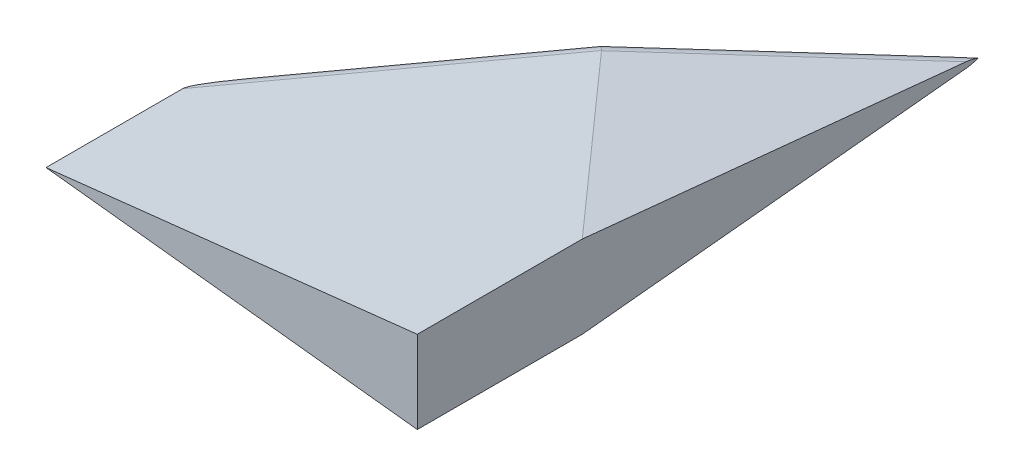
ISO-10303-21;
HEADER;
FILE_DESCRIPTION(('STEP AP214'),'2;1');
FILE_NAME('part.step','',(''),(''),'','','');
FILE_SCHEMA(('AUTOMOTIVE_DESIGN { 1 0 10303 214 1 1 1 1 }'));
ENDSEC;
DATA;
#1=APPLICATION_CONTEXT('core data for automotive mechanical design processes');
#2=APPLICATION_PROTOCOL_DEFINITION('international standard','automotive_design',2000,#1);
#3=PRODUCT_CONTEXT('',#1,'mechanical');
#4=PRODUCT('Part','Part','',(#3));
#5=PRODUCT_RELATED_PRODUCT_CATEGORY('part','',(#4));
#6=PRODUCT_DEFINITION_FORMATION('','',#4);
#7=PRODUCT_DEFINITION_CONTEXT('part definition',#1,'design');
#8=PRODUCT_DEFINITION('design','',#6,#7);
#9=PRODUCT_DEFINITION_SHAPE('','',#8);
#10=(LENGTH_UNIT() NAMED_UNIT(*) SI_UNIT(.MILLI.,.METRE.));
#11=(NAMED_UNIT(*) PLANE_ANGLE_UNIT() SI_UNIT($,.RADIAN.));
#12=(NAMED_UNIT(*) SI_UNIT($,.STERADIAN.) SOLID_ANGLE_UNIT());
#13=UNCERTAINTY_MEASURE_WITH_UNIT(LENGTH_MEASURE(1.E-05),#10,'distance_accuracy_value','');
#14=(GEOMETRIC_REPRESENTATION_CONTEXT(3) GLOBAL_UNCERTAINTY_ASSIGNED_CONTEXT((#13)) GLOBAL_UNIT_ASSIGNED_CONTEXT((#10,
#11,#12)) REPRESENTATION_CONTEXT('',''));
#15=CARTESIAN_POINT('',(0.,0.,0.));
#16=DIRECTION('',(0.,0.,1.));
#17=DIRECTION('',(1.,0.,0.));
#18=AXIS2_PLACEMENT_3D('',#15,#16,#17);
#19=CARTESIAN_POINT('',(-4.97237569060774,10.,-4.47513812154696));
#20=DIRECTION('',(-0.743294146247166,0.,-0.66896473162245));
#21=DIRECTION('',(-0.66896473162245,0.,0.743294146247166));
#22=AXIS2_PLACEMENT_3D('',#19,#20,#21);
#23=PLANE('',#22);
#24=DIRECTION('',(0.667124384994991,0.0741249316661102,-0.741249316661101));
#25=VECTOR('',#24,1.);
#26=CARTESIAN_POINT('',(-4.70725149736415,4.66805789143447,-4.76972055848429));
#27=LINE('',#26,#25);
#28=CARTESIAN_POINT('',(-1.71977252027437,5.,-8.08914164413959));
#29=VERTEX_POINT('',#28);
#30=CARTESIAN_POINT('',(-0.163411010822919,5.17292905660571,-9.81843221019676));
#31=VERTEX_POINT('',#30);
#32=EDGE_CURVE('E184',#29,#31,#27,.T.);
#33=ORIENTED_EDGE('',*,*,#32,.T.);
#34=DIRECTION('',(-0.667124384994991,0.0741249316661101,0.741249316661101));
#35=VECTOR('',#34,1.);
#36=CARTESIAN_POINT('',(22.3840272005419,2.66765814423184,-34.8711413339355));
#37=LINE('',#36,#35);
#38=CARTESIAN_POINT('',(1.39295049862887,5.00000000000004,-11.5477227762543));
#39=VERTEX_POINT('',#38);
#40=EDGE_CURVE('E187',#31,#39,#37,.F.);
#41=ORIENTED_EDGE('',*,*,#40,.T.);
#42=DIRECTION('',(-0.667124384994991,-0.0741249316661101,0.741249316661101));
#43=VECTOR('',#42,1.);
#44=CARTESIAN_POINT('',(-4.69014862363391,4.3241000975264,-4.78872375151788));
#45=LINE('',#44,#43);
#46=CARTESIAN_POINT('',(-0.163411010822941,4.82707094339428,-9.81843221019674));
#47=VERTEX_POINT('',#46);
#48=EDGE_CURVE('E178',#39,#47,#45,.T.);
#49=ORIENTED_EDGE('',*,*,#48,.T.);
#50=DIRECTION('',(0.667124384994991,-0.0741249316661101,-0.741249316661101));
#51=VECTOR('',#50,1.);
#52=CARTESIAN_POINT('',(-22.3858229259356,7.29622782285124,14.8731365843728));
#53=LINE('',#52,#51);
#54=EDGE_CURVE('E181',#47,#29,#53,.F.);
#55=ORIENTED_EDGE('',*,*,#54,.T.);
#56=EDGE_LOOP('',(#33,#41,#49,#55));
#57=FACE_BOUND('',#56,.T.);
#58=ADVANCED_FACE('F67',(#57),#23,.T.);
#59=CARTESIAN_POINT('',(0.,10.,35.));
#60=DIRECTION('',(0.,0.,-1.));
#61=DIRECTION('',(-1.,0.,0.));
#62=AXIS2_PLACEMENT_3D('',#59,#60,#61);
#63=PLANE('',#62);
#64=DIRECTION('',(-0.993883734673619,-0.110431526074847,0.));
#65=VECTOR('',#64,1.);
#66=CARTESIAN_POINT('',(-0.823170731707318,7.40853658536585,35.));
#67=LINE('',#66,#65);
#68=CARTESIAN_POINT('',(22.5,10.,35.));
#69=VERTEX_POINT('',#68);
#70=CARTESIAN_POINT('',(-22.5,5.,35.));
#71=VERTEX_POINT('',#70);
#72=EDGE_CURVE('E153',#69,#71,#67,.T.);
#73=ORIENTED_EDGE('',*,*,#72,.T.);
#74=DIRECTION('',(-0.993883734673619,0.110431526074846,0.));
#75=VECTOR('',#74,1.);
#76=CARTESIAN_POINT('',(0.274390243902438,2.46951219512195,35.));
#77=LINE('',#76,#75);
#78=CARTESIAN_POINT('',(22.5,0.,35.));
#79=VERTEX_POINT('',#78);
#80=EDGE_CURVE('E138',#79,#71,#77,.T.);
#81=ORIENTED_EDGE('',*,*,#80,.F.);
#82=DIRECTION('',(0.,-1.,0.));
#83=VECTOR('',#82,1.);
#84=CARTESIAN_POINT('',(22.5,10.,35.));
#85=LINE('',#84,#83);
#86=EDGE_CURVE('E152',#69,#79,#85,.T.);
#87=ORIENTED_EDGE('',*,*,#86,.F.);
#88=EDGE_LOOP('',(#73,#81,#87));
#89=FACE_BOUND('',#88,.T.);
#90=ADVANCED_FACE('F151',(#89),#63,.F.);
#91=CARTESIAN_POINT('',(-22.5,8.41584158415842,-0.841584158415842));
#92=DIRECTION('',(0.,-0.995037190209989,0.0995037190209989));
#93=DIRECTION('',(0.,-0.0995037190209989,-0.995037190209989));
#94=AXIS2_PLACEMENT_3D('',#91,#92,#93);
#95=PLANE('',#94);
#96=DIRECTION('',(0.,-0.0995037190209989,-0.995037190209989));
#97=VECTOR('',#96,1.);
#98=CARTESIAN_POINT('',(22.5,8.41584158415842,-0.841584158415842));
#99=LINE('',#98,#97);
#100=CARTESIAN_POINT('',(22.5,10.,15.));
#101=VERTEX_POINT('',#100);
#102=CARTESIAN_POINT('',(22.5,5.34883584933013,-31.5116415066987));
#103=VERTEX_POINT('',#102);
#104=EDGE_CURVE('E234',#101,#103,#99,.T.);
#105=ORIENTED_EDGE('',*,*,#104,.T.);
#106=DIRECTION('',(-0.667124384994991,0.0741249316661101,0.741249316661101));
#107=VECTOR('',#106,1.);
#108=CARTESIAN_POINT('',(1.74226256615985,7.65525111975682,-8.44748880243186));
#109=LINE('',#108,#107);
#110=CARTESIAN_POINT('',(1.56976132198561,7.67441792466506,-8.25582075334938));
#111=VERTEX_POINT('',#110);
#112=EDGE_CURVE('E165',#103,#111,#109,.T.);
#113=ORIENTED_EDGE('',*,*,#112,.T.);
#114=DIRECTION('',(-0.667124384994991,-0.0741249316661101,-0.741249316661101));
#115=VECTOR('',#114,1.);
#116=CARTESIAN_POINT('',(-5.43956043956039,6.8956043956044,-16.0439560439561));
#117=LINE('',#116,#115);
#118=EDGE_CURVE('E160',#101,#111,#117,.T.);
#119=ORIENTED_EDGE('',*,*,#118,.F.);
#120=EDGE_LOOP('',(#105,#113,#119));
#121=FACE_BOUND('',#120,.T.);
#122=ADVANCED_FACE('F249',(#121),#95,.F.);
#123=CARTESIAN_POINT('',(22.5,10.,0.));
#124=DIRECTION('',(1.,0.,0.));
#125=DIRECTION('',(0.,0.,-1.));
#126=AXIS2_PLACEMENT_3D('',#123,#124,#125);
#127=PLANE('',#126);
#128=CARTESIAN_POINT('',(22.5,7.13875712619484,-31.2628822091462));
#129=DIRECTION('',(1.,0.,0.));
#130=DIRECTION('',(0.,-0.0995037190209989,0.995037190209989));
#131=AXIS2_PLACEMENT_3D('',#128,#129,#130);
#132=ELLIPSE('',#131,3.74742710089779,2.5);
#133=CARTESIAN_POINT('',(22.5,4.65116415066987,-31.5116415066987));
#134=VERTEX_POINT('',#133);
#135=CARTESIAN_POINT('',(22.5,4.99999999999999,-32.9624381182908));
#136=VERTEX_POINT('',#135);
#137=EDGE_CURVE('E191',#134,#136,#132,.T.);
#138=ORIENTED_EDGE('',*,*,#137,.T.);
#139=CARTESIAN_POINT('',(22.5,2.86124287380516,-31.2628822091462));
#140=DIRECTION('',(1.,0.,0.));
#141=DIRECTION('',(0.,-0.0995037190209989,-0.995037190209989));
#142=AXIS2_PLACEMENT_3D('',#139,#140,#141);
#143=ELLIPSE('',#142,3.74742710089779,2.5);
#144=EDGE_CURVE('E194',#136,#103,#143,.T.);
#145=ORIENTED_EDGE('',*,*,#144,.T.);
#146=ORIENTED_EDGE('',*,*,#104,.F.);
#147=DIRECTION('',(0.,0.,1.));
#148=VECTOR('',#147,1.);
#149=CARTESIAN_POINT('',(22.5,10.,0.));
#150=LINE('',#149,#148);
#151=EDGE_CURVE('E146',#101,#69,#150,.T.);
#152=ORIENTED_EDGE('',*,*,#151,.T.);
#153=ORIENTED_EDGE('',*,*,#86,.T.);
#154=DIRECTION('',(0.,0.,1.));
#155=VECTOR('',#154,1.);
#156=CARTESIAN_POINT('',(22.5,0.,0.));
#157=LINE('',#156,#155);
#158=CARTESIAN_POINT('',(22.5,0.,15.));
#159=VERTEX_POINT('',#158);
#160=EDGE_CURVE('E135',#159,#79,#157,.T.);
#161=ORIENTED_EDGE('',*,*,#160,.F.);
#162=DIRECTION('',(0.,0.0995037190209989,-0.995037190209989));
#163=VECTOR('',#162,1.);
#164=CARTESIAN_POINT('',(22.5,1.48514851485148,0.148514851485148));
#165=LINE('',#164,#163);
#166=EDGE_CURVE('E147',#159,#134,#165,.T.);
#167=ORIENTED_EDGE('',*,*,#166,.T.);
#168=EDGE_LOOP('',(#138,#145,#146,#152,#153,#161,#167));
#169=FACE_BOUND('',#168,.T.);
#170=ADVANCED_FACE('F157',(#169),#127,.T.);
#171=CARTESIAN_POINT('',(-22.5,1.48514851485148,0.148514851485148));
#172=DIRECTION('',(0.,-0.995037190209989,-0.0995037190209989));
#173=DIRECTION('',(0.,0.0995037190209989,-0.995037190209989));
#174=AXIS2_PLACEMENT_3D('',#171,#172,#173);
#175=PLANE('',#174);
#176=DIRECTION('',(0.667124384994991,-0.0741249316661101,0.741249316661101));
#177=VECTOR('',#176,1.);
#178=CARTESIAN_POINT('',(-4.94505494505496,3.04945054945055,-15.4945054945055));
#179=LINE('',#178,#177);
#180=CARTESIAN_POINT('',(1.56976132198558,2.32558207533493,-8.25582075334935));
#181=VERTEX_POINT('',#180);
#182=EDGE_CURVE('E140',#181,#159,#179,.T.);
#183=ORIENTED_EDGE('',*,*,#182,.F.);
#184=DIRECTION('',(-0.667124384994991,-0.0741249316661101,0.741249316661101));
#185=VECTOR('',#184,1.);
#186=CARTESIAN_POINT('',(-13.3401550162578,0.668924704419007,8.31075295580991));
#187=LINE('',#186,#185);
#188=EDGE_CURVE('E12',#181,#134,#187,.F.);
#189=ORIENTED_EDGE('',*,*,#188,.T.);
#190=ORIENTED_EDGE('',*,*,#166,.F.);
#191=EDGE_LOOP('',(#183,#189,#190));
#192=FACE_BOUND('',#191,.T.);
#193=ADVANCED_FACE('F256',(#192),#175,.T.);
#194=CARTESIAN_POINT('',(-0.823170731707318,7.40853658536585,-35.));
#195=DIRECTION('',(-0.110431526074847,0.993883734673619,0.));
#196=DIRECTION('',(-0.993883734673619,-0.110431526074847,0.));
#197=AXIS2_PLACEMENT_3D('',#194,#195,#196);
#198=PLANE('',#197);
#199=ORIENTED_EDGE('',*,*,#118,.T.);
#200=CARTESIAN_POINT('',(-9.62440706787677,6.43062143690258,4.43090342182799));
#201=DIRECTION('',(-0.110431526074847,0.993883734673619,0.));
#202=DIRECTION('',(0.658035225121601,0.0731150250135112,-0.749429006388489));
#203=AXIS2_PLACEMENT_3D('',#200,#201,#202);
#204=ELLIPSE('',#203,16.9671978378616,2.5);
#205=CARTESIAN_POINT('',(1.54229462264742,7.67136606918304,-8.28329714007346));
#206=VERTEX_POINT('',#205);
#207=EDGE_CURVE('E175',#111,#206,#204,.T.);
#208=ORIENTED_EDGE('',*,*,#207,.T.);
#209=DIRECTION('',(0.667124384994991,0.0741249316661102,-0.741249316661101));
#210=VECTOR('',#209,1.);
#211=CARTESIAN_POINT('',(13.6880918662535,9.02089909625039,-21.7786274107469));
#212=LINE('',#211,#210);
#213=CARTESIAN_POINT('',(-22.5,4.99999999999999,18.430363551757));
#214=VERTEX_POINT('',#213);
#215=EDGE_CURVE('E172',#206,#214,#212,.F.);
#216=ORIENTED_EDGE('',*,*,#215,.T.);
#217=DIRECTION('',(0.,0.,1.));
#218=VECTOR('',#217,1.);
#219=CARTESIAN_POINT('',(-22.5,5.,-35.));
#220=LINE('',#219,#218);
#221=EDGE_CURVE('E232',#214,#71,#220,.T.);
#222=ORIENTED_EDGE('',*,*,#221,.T.);
#223=ORIENTED_EDGE('',*,*,#72,.F.);
#224=ORIENTED_EDGE('',*,*,#151,.F.);
#225=EDGE_LOOP('',(#199,#208,#216,#222,#223,#224));
#226=FACE_BOUND('',#225,.T.);
#227=ADVANCED_FACE('F231',(#226),#198,.T.);
#228=CARTESIAN_POINT('',(0.274390243902438,2.46951219512195,-35.));
#229=DIRECTION('',(0.110431526074846,0.993883734673619,0.));
#230=DIRECTION('',(-0.993883734673619,0.110431526074846,0.));
#231=AXIS2_PLACEMENT_3D('',#228,#229,#230);
#232=PLANE('',#231);
#233=ORIENTED_EDGE('',*,*,#221,.F.);
#234=DIRECTION('',(0.667124384994991,-0.07412493166611,-0.741249316661101));
#235=VECTOR('',#234,1.);
#236=CARTESIAN_POINT('',(1.69633362449522,2.3115184861672,-8.45445158657102));
#237=LINE('',#236,#235);
#238=CARTESIAN_POINT('',(1.5422946226474,2.32863393081695,-8.28329714007344));
#239=VERTEX_POINT('',#238);
#240=EDGE_CURVE('E77',#214,#239,#237,.T.);
#241=ORIENTED_EDGE('',*,*,#240,.T.);
#242=CARTESIAN_POINT('',(-9.6244070678768,3.56937856309742,4.43090342182802));
#243=DIRECTION('',(0.110431526074846,0.993883734673619,0.));
#244=DIRECTION('',(-0.658035225121601,0.0731150250135111,0.749429006388489));
#245=AXIS2_PLACEMENT_3D('',#242,#243,#244);
#246=ELLIPSE('',#245,16.9671978378616,2.5);
#247=EDGE_CURVE('E89',#239,#181,#246,.F.);
#248=ORIENTED_EDGE('',*,*,#247,.T.);
#249=ORIENTED_EDGE('',*,*,#182,.T.);
#250=ORIENTED_EDGE('',*,*,#160,.T.);
#251=ORIENTED_EDGE('',*,*,#80,.T.);
#252=EDGE_LOOP('',(#233,#241,#248,#249,#250,#251));
#253=FACE_BOUND('',#252,.T.);
#254=ADVANCED_FACE('F137',(#253),#232,.F.);
#255=CARTESIAN_POINT('',(14.4586761759461,3.40886518548861,-22.3280779601974));
#256=DIRECTION('',(-0.667124384994991,0.07412493166611,0.741249316661101));
#257=DIRECTION('',(0.743294146247166,0.,0.66896473162245));
#258=AXIS2_PLACEMENT_3D('',#255,#256,#257);
#259=CYLINDRICAL_SURFACE('',#258,2.5);
#260=CARTESIAN_POINT('',(0.138462845343583,5.,-6.41672981508351));
#261=DIRECTION('',(0.,1.,0.));
#262=DIRECTION('',(-0.66896473162245,0.,0.743294146247166));
#263=AXIS2_PLACEMENT_3D('',#260,#261,#262);
#264=ELLIPSE('',#263,33.7268439080802,2.5);
#265=EDGE_CURVE('E207',#29,#214,#264,.T.);
#266=ORIENTED_EDGE('',*,*,#265,.F.);
#267=ORIENTED_EDGE('',*,*,#54,.F.);
#268=CARTESIAN_POINT('',(1.69482435479496,4.82707094339428,-8.1460203811406));
#269=DIRECTION('',(-0.66896473162245,0.,0.743294146247166));
#270=DIRECTION('',(0.,-1.,0.));
#271=AXIS2_PLACEMENT_3D('',#268,#269,#270);
#272=ELLIPSE('',#271,2.50689656482678,2.5);
#273=EDGE_CURVE('E71',#239,#47,#272,.F.);
#274=ORIENTED_EDGE('',*,*,#273,.F.);
#275=ORIENTED_EDGE('',*,*,#240,.F.);
#276=EDGE_LOOP('',(#266,#267,#274,#275));
#277=FACE_BOUND('',#276,.T.);
#278=ADVANCED_FACE('F69',(#277),#259,.T.);
#279=CARTESIAN_POINT('',(-2.831913258016,4.3241000975264,-3.11631192246176));
#280=DIRECTION('',(-0.667124384994991,-0.0741249316661101,0.741249316661101));
#281=DIRECTION('',(0.743294146247166,0.,0.66896473162245));
#282=AXIS2_PLACEMENT_3D('',#279,#280,#281);
#283=CYLINDRICAL_SURFACE('',#282,2.5);
#284=ORIENTED_EDGE('',*,*,#273,.T.);
#285=ORIENTED_EDGE('',*,*,#48,.F.);
#286=CARTESIAN_POINT('',(3.25118586424633,5.,-9.87531094719768));
#287=DIRECTION('',(0.,-1.,0.));
#288=DIRECTION('',(-0.66896473162245,0.,0.743294146247166));
#289=AXIS2_PLACEMENT_3D('',#286,#287,#288);
#290=ELLIPSE('',#289,33.7268439080798,2.5);
#291=EDGE_CURVE('E205',#136,#39,#290,.F.);
#292=ORIENTED_EDGE('',*,*,#291,.F.);
#293=ORIENTED_EDGE('',*,*,#137,.F.);
#294=ORIENTED_EDGE('',*,*,#188,.F.);
#295=ORIENTED_EDGE('',*,*,#247,.F.);
#296=EDGE_LOOP('',(#284,#285,#292,#293,#294,#295));
#297=FACE_BOUND('',#296,.T.);
#298=ADVANCED_FACE('F218',(#297),#283,.T.);
#299=CARTESIAN_POINT('',(-2.84901613174623,4.66805789143447,-3.09730872942816));
#300=DIRECTION('',(0.667124384994991,0.0741249316661102,-0.741249316661101));
#301=DIRECTION('',(-0.743294146247166,0.,-0.66896473162245));
#302=AXIS2_PLACEMENT_3D('',#299,#300,#301);
#303=CYLINDRICAL_SURFACE('',#302,2.5);
#304=ORIENTED_EDGE('',*,*,#265,.T.);
#305=ORIENTED_EDGE('',*,*,#215,.F.);
#306=CARTESIAN_POINT('',(1.69482435479494,5.17292905660572,-8.14602038114057));
#307=DIRECTION('',(0.66896473162245,0.,-0.743294146247166));
#308=DIRECTION('',(0.,1.,0.));
#309=AXIS2_PLACEMENT_3D('',#306,#307,#308);
#310=ELLIPSE('',#309,2.50689656482678,2.5);
#311=EDGE_CURVE('E201',#31,#206,#310,.T.);
#312=ORIENTED_EDGE('',*,*,#311,.F.);
#313=ORIENTED_EDGE('',*,*,#32,.F.);
#314=EDGE_LOOP('',(#304,#305,#312,#313));
#315=FACE_BOUND('',#314,.T.);
#316=ADVANCED_FACE('F229',(#315),#303,.T.);
#317=CARTESIAN_POINT('',(-12.8456495217523,6.78853726511097,8.01006170391187));
#318=DIRECTION('',(0.667124384994991,-0.0741249316661101,-0.741249316661101));
#319=DIRECTION('',(-0.743294146247166,0.,-0.66896473162245));
#320=AXIS2_PLACEMENT_3D('',#317,#318,#319);
#321=CYLINDRICAL_SURFACE('',#320,2.5);
#322=ORIENTED_EDGE('',*,*,#291,.T.);
#323=ORIENTED_EDGE('',*,*,#40,.F.);
#324=ORIENTED_EDGE('',*,*,#311,.T.);
#325=ORIENTED_EDGE('',*,*,#207,.F.);
#326=ORIENTED_EDGE('',*,*,#112,.F.);
#327=ORIENTED_EDGE('',*,*,#144,.F.);
#328=EDGE_LOOP('',(#322,#323,#324,#325,#326,#327));
#329=FACE_BOUND('',#328,.T.);
#330=ADVANCED_FACE('F227',(#329),#321,.T.);
#331=CLOSED_SHELL('',(#58,#90,#122,#170,#193,#227,#254,#278,#298,#316,#330));
#332=MANIFOLD_SOLID_BREP('B2',#331);
#333=ADVANCED_BREP_SHAPE_REPRESENTATION('',(#18,#332),#14);
#334=SHAPE_DEFINITION_REPRESENTATION(#9,#333);
ENDSEC;
END-ISO-10303-21;
